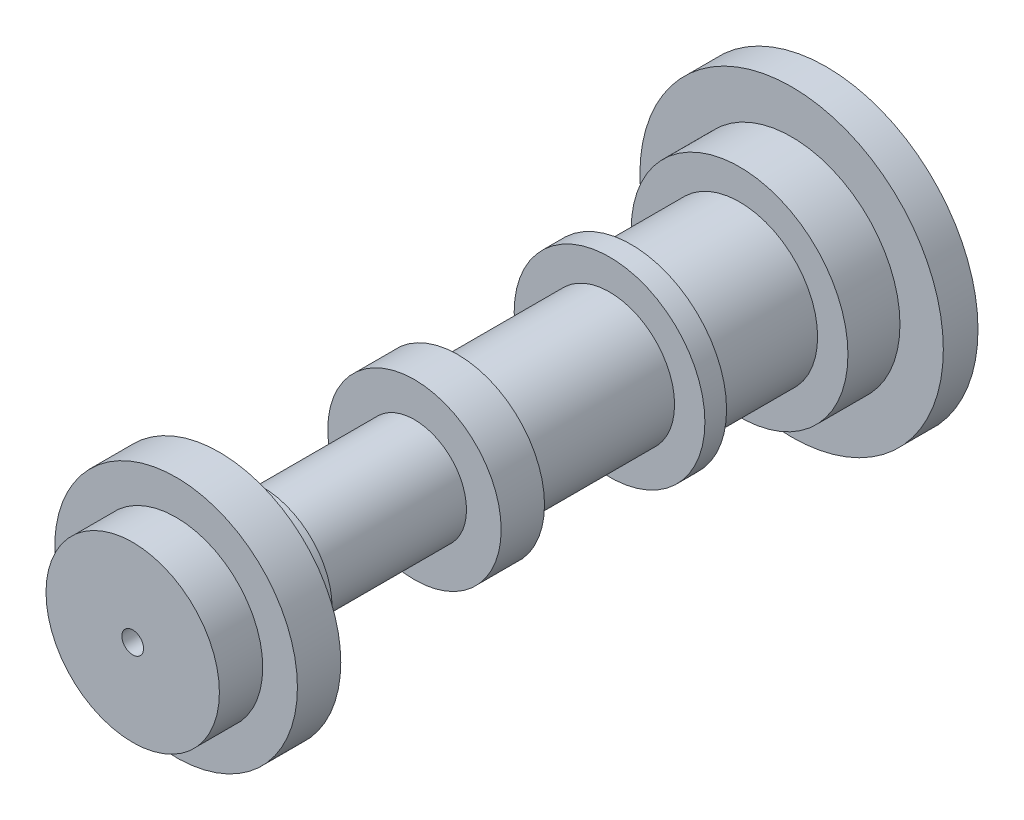
ISO-10303-21;
HEADER;
FILE_DESCRIPTION(('STEP AP214'),'2;1');
FILE_NAME('part.step','',(''),(''),'','','');
FILE_SCHEMA(('AUTOMOTIVE_DESIGN { 1 0 10303 214 1 1 1 1 }'));
ENDSEC;
DATA;
#1=APPLICATION_CONTEXT('core data for automotive mechanical design processes');
#2=APPLICATION_PROTOCOL_DEFINITION('international standard','automotive_design',2000,#1);
#3=PRODUCT_CONTEXT('',#1,'mechanical');
#4=PRODUCT('Part','Part','',(#3));
#5=PRODUCT_RELATED_PRODUCT_CATEGORY('part','',(#4));
#6=PRODUCT_DEFINITION_FORMATION('','',#4);
#7=PRODUCT_DEFINITION_CONTEXT('part definition',#1,'design');
#8=PRODUCT_DEFINITION('design','',#6,#7);
#9=PRODUCT_DEFINITION_SHAPE('','',#8);
#10=(LENGTH_UNIT() NAMED_UNIT(*) SI_UNIT(.MILLI.,.METRE.));
#11=(NAMED_UNIT(*) PLANE_ANGLE_UNIT() SI_UNIT($,.RADIAN.));
#12=(NAMED_UNIT(*) SI_UNIT($,.STERADIAN.) SOLID_ANGLE_UNIT());
#13=UNCERTAINTY_MEASURE_WITH_UNIT(LENGTH_MEASURE(1.E-05),#10,'distance_accuracy_value','');
#14=(GEOMETRIC_REPRESENTATION_CONTEXT(3) GLOBAL_UNCERTAINTY_ASSIGNED_CONTEXT((#13)) GLOBAL_UNIT_ASSIGNED_CONTEXT((#10,
#11,#12)) REPRESENTATION_CONTEXT('',''));
#15=CARTESIAN_POINT('',(0.,0.,0.));
#16=DIRECTION('',(0.,0.,1.));
#17=DIRECTION('',(1.,0.,0.));
#18=AXIS2_PLACEMENT_3D('',#15,#16,#17);
#19=CARTESIAN_POINT('',(0.,0.,85.));
#20=DIRECTION('',(0.,0.,1.));
#21=DIRECTION('',(1.,0.,0.));
#22=AXIS2_PLACEMENT_3D('',#19,#20,#21);
#23=CYLINDRICAL_SURFACE('',#22,20.);
#24=CARTESIAN_POINT('',(0.,0.,85.));
#25=DIRECTION('',(0.,0.,1.));
#26=DIRECTION('',(1.,0.,0.));
#27=AXIS2_PLACEMENT_3D('',#24,#25,#26);
#28=CIRCLE('',#27,20.);
#29=CARTESIAN_POINT('',(20.,0.,85.));
#30=VERTEX_POINT('',#29);
#31=EDGE_CURVE('E331',#30,#30,#28,.T.);
#32=ORIENTED_EDGE('',*,*,#31,.T.);
#33=DIRECTION('',(0.,0.,1.));
#34=VECTOR('',#33,1.);
#35=CARTESIAN_POINT('',(20.,0.,85.));
#36=LINE('',#35,#34);
#37=CARTESIAN_POINT('',(20.,0.,95.));
#38=VERTEX_POINT('',#37);
#39=EDGE_CURVE('E10',#30,#38,#36,.T.);
#40=ORIENTED_EDGE('',*,*,#39,.T.);
#41=CARTESIAN_POINT('',(0.,0.,95.));
#42=DIRECTION('',(0.,0.,1.));
#43=DIRECTION('',(1.,0.,0.));
#44=AXIS2_PLACEMENT_3D('',#41,#42,#43);
#45=CIRCLE('',#44,20.);
#46=EDGE_CURVE('E25',#38,#38,#45,.T.);
#47=ORIENTED_EDGE('',*,*,#46,.F.);
#48=ORIENTED_EDGE('',*,*,#39,.F.);
#49=EDGE_LOOP('',(#32,#40,#47,#48));
#50=FACE_BOUND('',#49,.T.);
#51=ADVANCED_FACE('F16',(#50),#23,.T.);
#52=CARTESIAN_POINT('',(0.,0.,95.));
#53=DIRECTION('',(0.,0.,1.));
#54=DIRECTION('',(1.,0.,0.));
#55=AXIS2_PLACEMENT_3D('',#52,#53,#54);
#56=PLANE('',#55);
#57=CARTESIAN_POINT('',(0.,0.,95.));
#58=DIRECTION('',(0.,0.,1.));
#59=DIRECTION('',(1.,0.,0.));
#60=AXIS2_PLACEMENT_3D('',#57,#58,#59);
#61=CIRCLE('',#60,12.);
#62=CARTESIAN_POINT('',(12.,0.,95.));
#63=VERTEX_POINT('',#62);
#64=EDGE_CURVE('E324',#63,#63,#61,.T.);
#65=ORIENTED_EDGE('',*,*,#64,.F.);
#66=EDGE_LOOP('',(#65));
#67=FACE_BOUND('',#66,.T.);
#68=ORIENTED_EDGE('',*,*,#46,.T.);
#69=EDGE_LOOP('',(#68));
#70=FACE_BOUND('',#69,.T.);
#71=ADVANCED_FACE('F336',(#67,#70),#56,.T.);
#72=CARTESIAN_POINT('',(0.,0.,85.));
#73=DIRECTION('',(0.,0.,1.));
#74=DIRECTION('',(1.,0.,0.));
#75=AXIS2_PLACEMENT_3D('',#72,#73,#74);
#76=PLANE('',#75);
#77=ORIENTED_EDGE('',*,*,#31,.F.);
#78=EDGE_LOOP('',(#77));
#79=FACE_BOUND('',#78,.T.);
#80=CARTESIAN_POINT('',(0.,0.,85.));
#81=DIRECTION('',(0.,0.,1.));
#82=DIRECTION('',(1.,0.,0.));
#83=AXIS2_PLACEMENT_3D('',#80,#81,#82);
#84=CIRCLE('',#83,15.);
#85=CARTESIAN_POINT('',(15.,0.,85.));
#86=VERTEX_POINT('',#85);
#87=EDGE_CURVE('E321',#86,#86,#84,.T.);
#88=ORIENTED_EDGE('',*,*,#87,.T.);
#89=EDGE_LOOP('',(#88));
#90=FACE_BOUND('',#89,.T.);
#91=ADVANCED_FACE('F18',(#79,#90),#76,.F.);
#92=CARTESIAN_POINT('',(0.,0.,95.));
#93=DIRECTION('',(0.,0.,1.));
#94=DIRECTION('',(1.,0.,0.));
#95=AXIS2_PLACEMENT_3D('',#92,#93,#94);
#96=CYLINDRICAL_SURFACE('',#95,12.);
#97=ORIENTED_EDGE('',*,*,#64,.T.);
#98=DIRECTION('',(0.,0.,1.));
#99=VECTOR('',#98,1.);
#100=CARTESIAN_POINT('',(12.,0.,95.));
#101=LINE('',#100,#99);
#102=CARTESIAN_POINT('',(12.,0.,130.));
#103=VERTEX_POINT('',#102);
#104=EDGE_CURVE('E328',#63,#103,#101,.T.);
#105=ORIENTED_EDGE('',*,*,#104,.T.);
#106=CARTESIAN_POINT('',(0.,0.,130.));
#107=DIRECTION('',(0.,0.,1.));
#108=DIRECTION('',(1.,0.,0.));
#109=AXIS2_PLACEMENT_3D('',#106,#107,#108);
#110=CIRCLE('',#109,12.);
#111=EDGE_CURVE('E313',#103,#103,#110,.T.);
#112=ORIENTED_EDGE('',*,*,#111,.F.);
#113=ORIENTED_EDGE('',*,*,#104,.F.);
#114=EDGE_LOOP('',(#97,#105,#112,#113));
#115=FACE_BOUND('',#114,.T.);
#116=ADVANCED_FACE('F346',(#115),#96,.T.);
#117=CARTESIAN_POINT('',(0.,0.,50.));
#118=DIRECTION('',(0.,0.,1.));
#119=DIRECTION('',(1.,0.,0.));
#120=AXIS2_PLACEMENT_3D('',#117,#118,#119);
#121=CYLINDRICAL_SURFACE('',#120,15.);
#122=CARTESIAN_POINT('',(0.,0.,50.));
#123=DIRECTION('',(0.,0.,1.));
#124=DIRECTION('',(1.,0.,0.));
#125=AXIS2_PLACEMENT_3D('',#122,#123,#124);
#126=CIRCLE('',#125,15.);
#127=CARTESIAN_POINT('',(15.,0.,50.));
#128=VERTEX_POINT('',#127);
#129=EDGE_CURVE('E309',#128,#128,#126,.T.);
#130=ORIENTED_EDGE('',*,*,#129,.T.);
#131=DIRECTION('',(0.,0.,1.));
#132=VECTOR('',#131,1.);
#133=CARTESIAN_POINT('',(15.,0.,50.));
#134=LINE('',#133,#132);
#135=EDGE_CURVE('E317',#128,#86,#134,.T.);
#136=ORIENTED_EDGE('',*,*,#135,.T.);
#137=ORIENTED_EDGE('',*,*,#87,.F.);
#138=ORIENTED_EDGE('',*,*,#135,.F.);
#139=EDGE_LOOP('',(#130,#136,#137,#138));
#140=FACE_BOUND('',#139,.T.);
#141=ADVANCED_FACE('F349',(#140),#121,.T.);
#142=CARTESIAN_POINT('',(0.,0.,130.));
#143=DIRECTION('',(0.,0.,1.));
#144=DIRECTION('',(1.,0.,0.));
#145=AXIS2_PLACEMENT_3D('',#142,#143,#144);
#146=PLANE('',#145);
#147=CARTESIAN_POINT('',(0.,0.,130.));
#148=DIRECTION('',(0.,0.,1.));
#149=DIRECTION('',(1.,0.,0.));
#150=AXIS2_PLACEMENT_3D('',#147,#148,#149);
#151=CIRCLE('',#150,16.);
#152=CARTESIAN_POINT('',(16.,0.,130.));
#153=VERTEX_POINT('',#152);
#154=EDGE_CURVE('E300',#153,#153,#151,.T.);
#155=ORIENTED_EDGE('',*,*,#154,.F.);
#156=EDGE_LOOP('',(#155));
#157=FACE_BOUND('',#156,.T.);
#158=ORIENTED_EDGE('',*,*,#111,.T.);
#159=EDGE_LOOP('',(#158));
#160=FACE_BOUND('',#159,.T.);
#161=ADVANCED_FACE('F353',(#157,#160),#146,.F.);
#162=CARTESIAN_POINT('',(0.,0.,50.));
#163=DIRECTION('',(0.,0.,1.));
#164=DIRECTION('',(1.,0.,0.));
#165=AXIS2_PLACEMENT_3D('',#162,#163,#164);
#166=PLANE('',#165);
#167=ORIENTED_EDGE('',*,*,#129,.F.);
#168=EDGE_LOOP('',(#167));
#169=FACE_BOUND('',#168,.T.);
#170=CARTESIAN_POINT('',(0.,0.,50.));
#171=DIRECTION('',(0.,0.,1.));
#172=DIRECTION('',(1.,0.,0.));
#173=AXIS2_PLACEMENT_3D('',#170,#171,#172);
#174=CIRCLE('',#173,22.);
#175=CARTESIAN_POINT('',(22.,0.,50.));
#176=VERTEX_POINT('',#175);
#177=EDGE_CURVE('E299',#176,#176,#174,.T.);
#178=ORIENTED_EDGE('',*,*,#177,.T.);
#179=EDGE_LOOP('',(#178));
#180=FACE_BOUND('',#179,.T.);
#181=ADVANCED_FACE('F357',(#169,#180),#166,.T.);
#182=CARTESIAN_POINT('',(0.,0.,130.));
#183=DIRECTION('',(0.,0.,1.));
#184=DIRECTION('',(1.,0.,0.));
#185=AXIS2_PLACEMENT_3D('',#182,#183,#184);
#186=CYLINDRICAL_SURFACE('',#185,16.);
#187=ORIENTED_EDGE('',*,*,#154,.T.);
#188=DIRECTION('',(0.,0.,1.));
#189=VECTOR('',#188,1.);
#190=CARTESIAN_POINT('',(16.,0.,130.));
#191=LINE('',#190,#189);
#192=CARTESIAN_POINT('',(16.,0.,140.));
#193=VERTEX_POINT('',#192);
#194=EDGE_CURVE('E304',#153,#193,#191,.T.);
#195=ORIENTED_EDGE('',*,*,#194,.T.);
#196=CARTESIAN_POINT('',(0.,0.,140.));
#197=DIRECTION('',(0.,0.,1.));
#198=DIRECTION('',(1.,0.,0.));
#199=AXIS2_PLACEMENT_3D('',#196,#197,#198);
#200=CIRCLE('',#199,16.);
#201=EDGE_CURVE('E291',#193,#193,#200,.T.);
#202=ORIENTED_EDGE('',*,*,#201,.F.);
#203=ORIENTED_EDGE('',*,*,#194,.F.);
#204=EDGE_LOOP('',(#187,#195,#202,#203));
#205=FACE_BOUND('',#204,.T.);
#206=ADVANCED_FACE('F361',(#205),#186,.T.);
#207=CARTESIAN_POINT('',(0.,0.,45.));
#208=DIRECTION('',(0.,0.,1.));
#209=DIRECTION('',(1.,0.,0.));
#210=AXIS2_PLACEMENT_3D('',#207,#208,#209);
#211=CYLINDRICAL_SURFACE('',#210,22.);
#212=CARTESIAN_POINT('',(0.,0.,45.));
#213=DIRECTION('',(0.,0.,1.));
#214=DIRECTION('',(1.,0.,0.));
#215=AXIS2_PLACEMENT_3D('',#212,#213,#214);
#216=CIRCLE('',#215,22.);
#217=CARTESIAN_POINT('',(22.,0.,45.));
#218=VERTEX_POINT('',#217);
#219=EDGE_CURVE('E287',#218,#218,#216,.T.);
#220=ORIENTED_EDGE('',*,*,#219,.T.);
#221=DIRECTION('',(0.,0.,1.));
#222=VECTOR('',#221,1.);
#223=CARTESIAN_POINT('',(22.,0.,45.));
#224=LINE('',#223,#222);
#225=EDGE_CURVE('E295',#218,#176,#224,.T.);
#226=ORIENTED_EDGE('',*,*,#225,.T.);
#227=ORIENTED_EDGE('',*,*,#177,.F.);
#228=ORIENTED_EDGE('',*,*,#225,.F.);
#229=EDGE_LOOP('',(#220,#226,#227,#228));
#230=FACE_BOUND('',#229,.T.);
#231=ADVANCED_FACE('F364',(#230),#211,.T.);
#232=CARTESIAN_POINT('',(0.,0.,140.));
#233=DIRECTION('',(0.,0.,1.));
#234=DIRECTION('',(1.,0.,0.));
#235=AXIS2_PLACEMENT_3D('',#232,#233,#234);
#236=PLANE('',#235);
#237=CARTESIAN_POINT('',(0.,0.,140.));
#238=DIRECTION('',(0.,0.,1.));
#239=DIRECTION('',(1.,0.,0.));
#240=AXIS2_PLACEMENT_3D('',#237,#238,#239);
#241=CIRCLE('',#240,28.);
#242=CARTESIAN_POINT('',(28.,0.,140.));
#243=VERTEX_POINT('',#242);
#244=EDGE_CURVE('E280',#243,#243,#241,.T.);
#245=ORIENTED_EDGE('',*,*,#244,.F.);
#246=EDGE_LOOP('',(#245));
#247=FACE_BOUND('',#246,.T.);
#248=ORIENTED_EDGE('',*,*,#201,.T.);
#249=EDGE_LOOP('',(#248));
#250=FACE_BOUND('',#249,.T.);
#251=ADVANCED_FACE('F369',(#247,#250),#236,.F.);
#252=CARTESIAN_POINT('',(0.,0.,45.));
#253=DIRECTION('',(0.,0.,1.));
#254=DIRECTION('',(1.,0.,0.));
#255=AXIS2_PLACEMENT_3D('',#252,#253,#254);
#256=PLANE('',#255);
#257=ORIENTED_EDGE('',*,*,#219,.F.);
#258=EDGE_LOOP('',(#257));
#259=FACE_BOUND('',#258,.T.);
#260=CARTESIAN_POINT('',(0.,0.,45.));
#261=DIRECTION('',(0.,0.,1.));
#262=DIRECTION('',(1.,0.,0.));
#263=AXIS2_PLACEMENT_3D('',#260,#261,#262);
#264=CIRCLE('',#263,18.);
#265=CARTESIAN_POINT('',(18.,0.,45.));
#266=VERTEX_POINT('',#265);
#267=EDGE_CURVE('E277',#266,#266,#264,.T.);
#268=ORIENTED_EDGE('',*,*,#267,.T.);
#269=EDGE_LOOP('',(#268));
#270=FACE_BOUND('',#269,.T.);
#271=ADVANCED_FACE('F373',(#259,#270),#256,.F.);
#272=CARTESIAN_POINT('',(0.,0.,140.));
#273=DIRECTION('',(0.,0.,1.));
#274=DIRECTION('',(1.,0.,0.));
#275=AXIS2_PLACEMENT_3D('',#272,#273,#274);
#276=CYLINDRICAL_SURFACE('',#275,28.);
#277=ORIENTED_EDGE('',*,*,#244,.T.);
#278=DIRECTION('',(0.,0.,1.));
#279=VECTOR('',#278,1.);
#280=CARTESIAN_POINT('',(28.,0.,140.));
#281=LINE('',#280,#279);
#282=CARTESIAN_POINT('',(28.,0.,150.));
#283=VERTEX_POINT('',#282);
#284=EDGE_CURVE('E284',#243,#283,#281,.T.);
#285=ORIENTED_EDGE('',*,*,#284,.T.);
#286=CARTESIAN_POINT('',(0.,0.,150.));
#287=DIRECTION('',(0.,0.,1.));
#288=DIRECTION('',(1.,0.,0.));
#289=AXIS2_PLACEMENT_3D('',#286,#287,#288);
#290=CIRCLE('',#289,28.);
#291=EDGE_CURVE('E246',#283,#283,#290,.T.);
#292=ORIENTED_EDGE('',*,*,#291,.F.);
#293=ORIENTED_EDGE('',*,*,#284,.F.);
#294=EDGE_LOOP('',(#277,#285,#292,#293));
#295=FACE_BOUND('',#294,.T.);
#296=ADVANCED_FACE('F379',(#295),#276,.T.);
#297=CARTESIAN_POINT('',(0.,0.,20.));
#298=DIRECTION('',(0.,0.,1.));
#299=DIRECTION('',(1.,0.,0.));
#300=AXIS2_PLACEMENT_3D('',#297,#298,#299);
#301=CYLINDRICAL_SURFACE('',#300,18.);
#302=CARTESIAN_POINT('',(0.,0.,20.));
#303=DIRECTION('',(0.,0.,1.));
#304=DIRECTION('',(1.,0.,0.));
#305=AXIS2_PLACEMENT_3D('',#302,#303,#304);
#306=CIRCLE('',#305,18.);
#307=CARTESIAN_POINT('',(18.,0.,20.));
#308=VERTEX_POINT('',#307);
#309=EDGE_CURVE('E254',#308,#308,#306,.T.);
#310=ORIENTED_EDGE('',*,*,#309,.T.);
#311=DIRECTION('',(0.,0.,1.));
#312=VECTOR('',#311,1.);
#313=CARTESIAN_POINT('',(18.,0.,20.));
#314=LINE('',#313,#312);
#315=EDGE_CURVE('E253',#308,#266,#314,.T.);
#316=ORIENTED_EDGE('',*,*,#315,.T.);
#317=ORIENTED_EDGE('',*,*,#267,.F.);
#318=ORIENTED_EDGE('',*,*,#315,.F.);
#319=EDGE_LOOP('',(#310,#316,#317,#318));
#320=FACE_BOUND('',#319,.T.);
#321=ADVANCED_FACE('F375',(#320),#301,.T.);
#322=CARTESIAN_POINT('',(0.,0.,150.));
#323=DIRECTION('',(0.,0.,1.));
#324=DIRECTION('',(1.,0.,0.));
#325=AXIS2_PLACEMENT_3D('',#322,#323,#324);
#326=PLANE('',#325);
#327=CARTESIAN_POINT('',(0.,0.,150.));
#328=DIRECTION('',(0.,0.,1.));
#329=DIRECTION('',(1.,0.,0.));
#330=AXIS2_PLACEMENT_3D('',#327,#328,#329);
#331=CIRCLE('',#330,20.);
#332=CARTESIAN_POINT('',(20.,0.,150.));
#333=VERTEX_POINT('',#332);
#334=EDGE_CURVE('E264',#333,#333,#331,.T.);
#335=ORIENTED_EDGE('',*,*,#334,.F.);
#336=EDGE_LOOP('',(#335));
#337=FACE_BOUND('',#336,.T.);
#338=ORIENTED_EDGE('',*,*,#291,.T.);
#339=EDGE_LOOP('',(#338));
#340=FACE_BOUND('',#339,.T.);
#341=ADVANCED_FACE('F378',(#337,#340),#326,.T.);
#342=CARTESIAN_POINT('',(0.,0.,20.));
#343=DIRECTION('',(0.,0.,1.));
#344=DIRECTION('',(1.,0.,0.));
#345=AXIS2_PLACEMENT_3D('',#342,#343,#344);
#346=PLANE('',#345);
#347=ORIENTED_EDGE('',*,*,#309,.F.);
#348=EDGE_LOOP('',(#347));
#349=FACE_BOUND('',#348,.T.);
#350=CARTESIAN_POINT('',(0.,0.,20.));
#351=DIRECTION('',(0.,0.,1.));
#352=DIRECTION('',(1.,0.,0.));
#353=AXIS2_PLACEMENT_3D('',#350,#351,#352);
#354=CIRCLE('',#353,25.);
#355=CARTESIAN_POINT('',(25.,0.,20.));
#356=VERTEX_POINT('',#355);
#357=EDGE_CURVE('E240',#356,#356,#354,.T.);
#358=ORIENTED_EDGE('',*,*,#357,.T.);
#359=EDGE_LOOP('',(#358));
#360=FACE_BOUND('',#359,.T.);
#361=ADVANCED_FACE('F389',(#349,#360),#346,.T.);
#362=CARTESIAN_POINT('',(24.491194523982,-0.04327504183174,3.935409580208));
#363=DIRECTION('',(-0.0127321503142022,-0.999917222174171,-0.00185503311746331));
#364=DIRECTION('',(-0.999918942610119,0.0127321722208647,0.));
#365=AXIS2_PLACEMENT_3D('',#362,#363,#364);
#366=PLANE('',#365);
#367=CARTESIAN_POINT('',(24.624048443109,-0.04413878898903,3.489142393827));
#368=CARTESIAN_POINT('',(26.5205402971,-0.07054449870163,4.705888623014));
#369=(BOUNDED_CURVE() B_SPLINE_CURVE(1,(#367,#368),.UNSPECIFIED.,.F.,
.F.) B_SPLINE_CURVE_WITH_KNOTS((2,2),(0.,2.253408529317),
.UNSPECIFIED.) CURVE() GEOMETRIC_REPRESENTATION_ITEM() RATIONAL_B_SPLINE_CURVE((1.,1.)) REPRESENTATION_ITEM(''));
#370=CARTESIAN_POINT('',(24.624048443109,-0.04413878898903,3.489142393827));
#371=VERTEX_POINT('',#370);
#372=CARTESIAN_POINT('',(26.5205402971,-0.07054449870163,4.705888623014));
#373=VERTEX_POINT('',#372);
#374=EDGE_CURVE('E187',#371,#373,#369,.T.);
#375=ORIENTED_EDGE('',*,*,#374,.T.);
#376=CARTESIAN_POINT('',(26.5205402971,-0.07054449870163,4.705888623014));
#377=CARTESIAN_POINT('',(22.370900679457,-0.01541428785405,3.470432551947));
#378=(BOUNDED_CURVE() B_SPLINE_CURVE(1,(#376,#377),.UNSPECIFIED.,.F.,
.F.) B_SPLINE_CURVE_WITH_KNOTS((2,2),(0.,4.33),
.UNSPECIFIED.) CURVE() GEOMETRIC_REPRESENTATION_ITEM() RATIONAL_B_SPLINE_CURVE((1.,1.)) REPRESENTATION_ITEM(''));
#379=CARTESIAN_POINT('',(22.370900679457,-0.01541428785405,3.470432551947));
#380=VERTEX_POINT('',#379);
#381=EDGE_CURVE('E206',#373,#380,#378,.T.);
#382=ORIENTED_EDGE('',*,*,#381,.T.);
#383=CARTESIAN_POINT('',(22.370900679457,-0.01541428785405,3.470432551947));
#384=CARTESIAN_POINT('',(24.624048443109,-0.04413878898903,3.489142393827));
#385=(BOUNDED_CURVE() B_SPLINE_CURVE(1,(#383,#384),.UNSPECIFIED.,.F.,
.F.) B_SPLINE_CURVE_WITH_KNOTS((2,2),(0.,2.253408529317),
.UNSPECIFIED.) CURVE() GEOMETRIC_REPRESENTATION_ITEM() RATIONAL_B_SPLINE_CURVE((1.,1.)) REPRESENTATION_ITEM(''));
#386=EDGE_CURVE('E181',#380,#371,#385,.T.);
#387=ORIENTED_EDGE('',*,*,#386,.T.);
#388=EDGE_LOOP('',(#375,#382,#387));
#389=FACE_BOUND('',#388,.T.);
#390=ADVANCED_FACE('F408',(#389),#366,.T.);
#391=CARTESIAN_POINT('',(0.,0.,150.));
#392=DIRECTION('',(0.,0.,1.));
#393=DIRECTION('',(1.,0.,0.));
#394=AXIS2_PLACEMENT_3D('',#391,#392,#393);
#395=CYLINDRICAL_SURFACE('',#394,20.);
#396=ORIENTED_EDGE('',*,*,#334,.T.);
#397=DIRECTION('',(0.,0.,1.));
#398=VECTOR('',#397,1.);
#399=CARTESIAN_POINT('',(20.,0.,150.));
#400=LINE('',#399,#398);
#401=CARTESIAN_POINT('',(20.,0.,160.));
#402=VERTEX_POINT('',#401);
#403=EDGE_CURVE('E268',#333,#402,#400,.T.);
#404=ORIENTED_EDGE('',*,*,#403,.T.);
#405=CARTESIAN_POINT('',(0.,0.,160.));
#406=DIRECTION('',(0.,0.,1.));
#407=DIRECTION('',(1.,0.,0.));
#408=AXIS2_PLACEMENT_3D('',#405,#406,#407);
#409=CIRCLE('',#408,20.);
#410=EDGE_CURVE('E231',#402,#402,#409,.T.);
#411=ORIENTED_EDGE('',*,*,#410,.F.);
#412=ORIENTED_EDGE('',*,*,#403,.F.);
#413=EDGE_LOOP('',(#396,#404,#411,#412));
#414=FACE_BOUND('',#413,.T.);
#415=ADVANCED_FACE('F385',(#414),#395,.T.);
#416=CARTESIAN_POINT('',(0.,0.,8.));
#417=DIRECTION('',(0.,0.,1.));
#418=DIRECTION('',(1.,0.,0.));
#419=AXIS2_PLACEMENT_3D('',#416,#417,#418);
#420=CYLINDRICAL_SURFACE('',#419,25.);
#421=CARTESIAN_POINT('',(0.,0.,8.));
#422=DIRECTION('',(0.,0.,1.));
#423=DIRECTION('',(1.,0.,0.));
#424=AXIS2_PLACEMENT_3D('',#421,#422,#423);
#425=CIRCLE('',#424,25.);
#426=CARTESIAN_POINT('',(25.,0.,8.));
#427=VERTEX_POINT('',#426);
#428=EDGE_CURVE('E224',#427,#427,#425,.T.);
#429=ORIENTED_EDGE('',*,*,#428,.T.);
#430=DIRECTION('',(0.,0.,1.));
#431=VECTOR('',#430,1.);
#432=CARTESIAN_POINT('',(25.,0.,8.));
#433=LINE('',#432,#431);
#434=EDGE_CURVE('E236',#427,#356,#433,.T.);
#435=ORIENTED_EDGE('',*,*,#434,.T.);
#436=ORIENTED_EDGE('',*,*,#357,.F.);
#437=ORIENTED_EDGE('',*,*,#434,.F.);
#438=EDGE_LOOP('',(#429,#435,#436,#437));
#439=FACE_BOUND('',#438,.T.);
#440=ADVANCED_FACE('F381',(#439),#420,.T.);
#441=CARTESIAN_POINT('',(0.,0.,0.));
#442=CARTESIAN_POINT('',(1.230431771827,0.005871800931862,-0.004086971408472));
#443=CARTESIAN_POINT('',(2.455568121686,0.869020610491,0.01196284594141));
#444=CARTESIAN_POINT('',(3.182290926081,2.590495735677,0.04685987788109));
#445=CARTESIAN_POINT('',(2.880230233196,4.866330749076,0.103308947431));
#446=CARTESIAN_POINT('',(1.280615577607,7.094213354344,0.177336526859));
#447=CARTESIAN_POINT('',(-1.579840317336,8.508298943587,0.273498649581));
#448=CARTESIAN_POINT('',(-5.100942111298,8.502506963589,0.387876068694));
#449=CARTESIAN_POINT('',(-8.53626888323,6.876701433573,0.523044049507));
#450=CARTESIAN_POINT('',(-11.11801598194,3.859349909009,0.677744737696));
#451=CARTESIAN_POINT('',(-13.57855170141,-3.89485342789,1.027042058902));
#452=CARTESIAN_POINT('',(-13.45352695528,-8.631909083152,1.22148553514));
#453=CARTESIAN_POINT('',(-11.47511626432,-13.69605045387,1.435924256721));
#454=CARTESIAN_POINT('',(-7.353991649431,-18.25508503753,1.670210324569));
#455=CARTESIAN_POINT('',(-1.298572612119,-21.29024615266,1.923511435184));
#456=CARTESIAN_POINT('',(6.013737067874,-21.89168792084,2.198507353601));
#457=CARTESIAN_POINT('',(13.342766160861,-19.60275627723,2.490507989691));
#458=CARTESIAN_POINT('',(19.470883527664,-14.64358380392,2.804630082805));
#459=CARTESIAN_POINT('',(23.394230914252,-7.769709374334,3.136804915497));
#460=CARTESIAN_POINT('',(24.624048443109,-0.04413878898903,3.489142393827));
#461=CARTESIAN_POINT('',(2.165,0.,0.625));
#462=CARTESIAN_POINT('',(3.386384465201,0.684611289215,0.652252898744));
#463=CARTESIAN_POINT('',(4.36556194636,2.220316520652,0.699412976511));
#464=CARTESIAN_POINT('',(4.612972343448,4.514346956081,0.765454584273));
#465=CARTESIAN_POINT('',(3.644370321724,7.173152661463,0.8526384293));
#466=CARTESIAN_POINT('',(1.276640716685,9.525200278201,0.95738186646));
#467=CARTESIAN_POINT('',(-2.341194963932,10.786661082604,1.084151753567));
#468=CARTESIAN_POINT('',(-6.50200372983,10.381482738668,1.228693352834));
#469=CARTESIAN_POINT('',(-10.38225579262,8.185090993645,1.394085592715));
#470=CARTESIAN_POINT('',(-13.17943311905,4.516381980866,1.578656155392));
#471=CARTESIAN_POINT('',(-15.62158512645,-4.524610583501,1.987351117623));
#472=CARTESIAN_POINT('',(-15.26278879505,-9.897219912958,2.211230745144));
#473=CARTESIAN_POINT('',(-12.83085238918,-15.50035186261,2.455028424058));
#474=CARTESIAN_POINT('',(-8.081543562267,-20.41744829648,2.718170360477));
#475=CARTESIAN_POINT('',(-1.305345397009,-23.56643370043,3.000363635086));
#476=CARTESIAN_POINT('',(6.71454648391,-24.02257560373,3.303882711467));
#477=CARTESIAN_POINT('',(14.638474117564,-21.35914124257,3.624046834582));
#478=CARTESIAN_POINT('',(21.178441529456,-15.86861627845,3.966266335407));
#479=CARTESIAN_POINT('',(25.300055679177,-8.390676768963,4.32610120318));
#480=CARTESIAN_POINT('',(26.5205402971,-0.07054449870163,4.705888623014));
#481=(BOUNDED_SURFACE() B_SPLINE_SURFACE(1,10,((#441,#442,#443,#444,#445,#446,#447,#448,#449,
#450,#451,#452,#453,#454,#455,#456,#457,#458,#459,#460),(#461,#462,#463,#464,#465,#466,#467,
#468,#469,#470,#471,#472,#473,#474,#475,#476,#477,#478,#479,#480)),.UNSPECIFIED.,.F.,.F.,
.F.) B_SPLINE_SURFACE_WITH_KNOTS((2,2),(11,9,11),(0.,2.253408529317),(0.,0.5,1.),
.UNSPECIFIED.) GEOMETRIC_REPRESENTATION_ITEM() RATIONAL_B_SPLINE_SURFACE(((1.,1.,1.,1.,1.,1.,1.,
1.,1.,1.,1.,1.,1.,1.,1.,1.,1.,1.,1.,1.),(1.,1.,1.,1.,1.,1.,1.,1.,1.,1.,1.,1.,1.,1.,1.,1.,1.,1.,
1.,1.))) REPRESENTATION_ITEM('') SURFACE());
#482=CARTESIAN_POINT('',(0.,0.,0.));
#483=CARTESIAN_POINT('',(1.230431771827,0.005871800931862,-0.004086971408472));
#484=CARTESIAN_POINT('',(2.455568121686,0.869020610491,0.01196284594141));
#485=CARTESIAN_POINT('',(3.182290926081,2.590495735677,0.04685987788109));
#486=CARTESIAN_POINT('',(2.880230233196,4.866330749076,0.103308947431));
#487=CARTESIAN_POINT('',(1.280615577607,7.094213354344,0.177336526859));
#488=CARTESIAN_POINT('',(-1.579840317336,8.508298943587,0.273498649581));
#489=CARTESIAN_POINT('',(-5.100942111298,8.502506963589,0.387876068694));
#490=CARTESIAN_POINT('',(-8.53626888323,6.876701433573,0.523044049507));
#491=CARTESIAN_POINT('',(-11.11801598194,3.859349909009,0.677744737696));
#492=CARTESIAN_POINT('',(-13.57855170141,-3.89485342789,1.027042058902));
#493=CARTESIAN_POINT('',(-13.45352695528,-8.631909083152,1.22148553514));
#494=CARTESIAN_POINT('',(-11.47511626432,-13.69605045387,1.435924256721));
#495=CARTESIAN_POINT('',(-7.353991649431,-18.25508503753,1.670210324569));
#496=CARTESIAN_POINT('',(-1.298572612119,-21.29024615266,1.923511435184));
#497=CARTESIAN_POINT('',(6.013737067874,-21.89168792084,2.198507353601));
#498=CARTESIAN_POINT('',(13.342766160861,-19.60275627723,2.490507989691));
#499=CARTESIAN_POINT('',(19.470883527664,-14.64358380392,2.804630082805));
#500=CARTESIAN_POINT('',(23.394230914252,-7.769709374334,3.136804915497));
#501=CARTESIAN_POINT('',(24.624048443109,-0.04413878898903,3.489142393827));
#502=(BOUNDED_CURVE() B_SPLINE_CURVE(10,(#482,#483,#484,#485,#486,#487,#488,#489,#490,#491,#492,
#493,#494,#495,#496,#497,#498,#499,#500,#501),.UNSPECIFIED.,.F.,
.F.) B_SPLINE_CURVE_WITH_KNOTS((11,9,11),(0.,0.5,1.),
.UNSPECIFIED.) CURVE() GEOMETRIC_REPRESENTATION_ITEM() RATIONAL_B_SPLINE_CURVE((1.,1.,1.,1.,1.,
1.,1.,1.,1.,1.,1.,1.,1.,1.,1.,1.,1.,1.,1.,1.)) REPRESENTATION_ITEM(''));
#503=CARTESIAN_POINT('',(2.002556967409,1.496584642539,0.02854663263037));
#504=VERTEX_POINT('',#503);
#505=EDGE_CURVE('E188',#504,#371,#502,.T.);
#506=CARTESIAN_POINT('',(2.490621341423,0.216345403574,0.633147503592));
#507=CARTESIAN_POINT('',(2.478458382284,0.356368371963,0.575191747016));
#508=CARTESIAN_POINT('',(2.45648241013,0.495223503842,0.5165594871));
#509=CARTESIAN_POINT('',(2.42486401805,0.631973533698,0.457248635784));
#510=CARTESIAN_POINT('',(2.383909739951,0.765737227712,0.397261511036));
#511=CARTESIAN_POINT('',(2.284456709617,1.024892658518,0.276309133067));
#512=CARTESIAN_POINT('',(2.226064218663,1.150330946062,0.215351320812));
#513=CARTESIAN_POINT('',(2.159263153863,1.271224315269,0.153735172604));
#514=CARTESIAN_POINT('',(2.084563492342,1.386852968693,0.09146506846171));
#515=CARTESIAN_POINT('',(2.002556967409,1.496584642539,0.02854663263037));
#516=(BOUNDED_CURVE() B_SPLINE_CURVE(5,(#506,#507,#508,#509,#510,#511,#512,#513,#514,#515),
.UNSPECIFIED.,.F.,.F.) B_SPLINE_CURVE_WITH_KNOTS((6,4,6),(0.,0.501503719603,1.),
.UNSPECIFIED.) CURVE() GEOMETRIC_REPRESENTATION_ITEM() RATIONAL_B_SPLINE_CURVE((1.,1.,1.,1.,1.,
1.,1.,1.,1.,1.)) REPRESENTATION_ITEM(''));
#517=CARTESIAN_POINT('',(2.490621341423,0.216345403574,0.633147503592));
#518=VERTEX_POINT('',#517);
#519=EDGE_CURVE('E171',#518,#504,#516,.T.);
#520=CARTESIAN_POINT('',(2.165,0.,0.625));
#521=CARTESIAN_POINT('',(3.386384465201,0.684611289215,0.652252898744));
#522=CARTESIAN_POINT('',(4.36556194636,2.220316520652,0.699412976511));
#523=CARTESIAN_POINT('',(4.612972343448,4.514346956081,0.765454584273));
#524=CARTESIAN_POINT('',(3.644370321724,7.173152661463,0.8526384293));
#525=CARTESIAN_POINT('',(1.276640716685,9.525200278201,0.95738186646));
#526=CARTESIAN_POINT('',(-2.341194963932,10.786661082604,1.084151753567));
#527=CARTESIAN_POINT('',(-6.50200372983,10.381482738668,1.228693352834));
#528=CARTESIAN_POINT('',(-10.38225579262,8.185090993645,1.394085592715));
#529=CARTESIAN_POINT('',(-13.17943311905,4.516381980866,1.578656155392));
#530=CARTESIAN_POINT('',(-15.62158512645,-4.524610583501,1.987351117623));
#531=CARTESIAN_POINT('',(-15.26278879505,-9.897219912958,2.211230745144));
#532=CARTESIAN_POINT('',(-12.83085238918,-15.50035186261,2.455028424058));
#533=CARTESIAN_POINT('',(-8.081543562267,-20.41744829648,2.718170360477));
#534=CARTESIAN_POINT('',(-1.305345397009,-23.56643370043,3.000363635086));
#535=CARTESIAN_POINT('',(6.71454648391,-24.02257560373,3.303882711467));
#536=CARTESIAN_POINT('',(14.638474117564,-21.35914124257,3.624046834582));
#537=CARTESIAN_POINT('',(21.178441529456,-15.86861627845,3.966266335407));
#538=CARTESIAN_POINT('',(25.300055679177,-8.390676768963,4.32610120318));
#539=CARTESIAN_POINT('',(26.5205402971,-0.07054449870163,4.705888623014));
#540=(BOUNDED_CURVE() B_SPLINE_CURVE(10,(#520,#521,#522,#523,#524,#525,#526,#527,#528,#529,#530,
#531,#532,#533,#534,#535,#536,#537,#538,#539),.UNSPECIFIED.,.F.,
.F.) B_SPLINE_CURVE_WITH_KNOTS((11,9,11),(0.,0.5,1.),
.UNSPECIFIED.) CURVE() GEOMETRIC_REPRESENTATION_ITEM() RATIONAL_B_SPLINE_CURVE((1.,1.,1.,1.,1.,
1.,1.,1.,1.,1.,1.,1.,1.,1.,1.,1.,1.,1.,1.,1.)) REPRESENTATION_ITEM(''));
#541=EDGE_CURVE('E235',#518,#373,#540,.T.);
#542=ORIENTED_EDGE('',*,*,#505,.F.);
#543=ORIENTED_EDGE('',*,*,#519,.F.);
#544=ORIENTED_EDGE('',*,*,#541,.T.);
#545=ORIENTED_EDGE('',*,*,#374,.F.);
#546=EDGE_LOOP('',(#542,#543,#544,#545));
#547=FACE_BOUND('',#546,.T.);
#548=ADVANCED_FACE('F384',(#547),#481,.T.);
#549=CARTESIAN_POINT('',(-2.165,0.,0.625));
#550=CARTESIAN_POINT('',(-0.943615534799,-0.67286828874,0.589573158439));
#551=CARTESIAN_POINT('',(0.509434041411,-0.494891550374,0.574221679791));
#552=CARTESIAN_POINT('',(1.704726696474,0.628820894393,0.577395135454));
#553=CARTESIAN_POINT('',(2.073548806312,2.488260096655,0.602229186465));
#554=CARTESIAN_POINT('',(1.265417469983,4.559351561935,0.644395265566));
#555=CARTESIAN_POINT('',(-0.795838161708,6.105235548121,0.708475058937));
#556=CARTESIAN_POINT('',(-3.625751623011,6.498853073038,0.790965202946));
#557=CARTESIAN_POINT('',(-6.565924801412,5.467268583537,0.893866784334));
#558=CARTESIAN_POINT('',(-8.894462377962,3.145234433658,1.016381377094));
#559=CARTESIAN_POINT('',(-11.33721567104,-3.209178164793,1.301064955803));
#560=CARTESIAN_POINT('',(-11.44763085094,-7.241627813436,1.463180445571));
#561=CARTESIAN_POINT('',(-9.951417003741,-11.6929744022,1.64506996502));
#562=CARTESIAN_POINT('',(-6.518337652625,-15.8274545645,1.84704035608));
#563=CARTESIAN_POINT('',(-1.27168417152,-18.70456780366,2.06769886077));
#564=CARTESIAN_POINT('',(5.226822035062,-19.44234852901,2.310115223386));
#565=CARTESIAN_POINT('',(11.854521001138,-17.56101438733,2.569660561657));
#566=CARTESIAN_POINT('',(17.481789994626,-13.204928326,2.851062088004));
#567=CARTESIAN_POINT('',(21.149817639553,-7.034610086615,3.150707273752));
#568=CARTESIAN_POINT('',(22.370900679457,-0.01541428785405,3.470432551947));
#569=CARTESIAN_POINT('',(0.,0.,0.));
#570=CARTESIAN_POINT('',(1.230431771827,0.00587180093185,-0.004086971408471));
#571=CARTESIAN_POINT('',(2.455568121686,0.869020610491,0.01196284594141));
#572=CARTESIAN_POINT('',(3.182290926081,2.590495735677,0.04685987788109));
#573=CARTESIAN_POINT('',(2.880230233196,4.866330749076,0.103308947431));
#574=CARTESIAN_POINT('',(1.280615577607,7.094213354344,0.177336526859));
#575=CARTESIAN_POINT('',(-1.579840317336,8.508298943587,0.273498649581));
#576=CARTESIAN_POINT('',(-5.100942111298,8.502506963589,0.387876068694));
#577=CARTESIAN_POINT('',(-8.53626888323,6.876701433573,0.523044049507));
#578=CARTESIAN_POINT('',(-11.11801598194,3.859349909009,0.677744737696));
#579=CARTESIAN_POINT('',(-13.57855170141,-3.89485342789,1.027042058902));
#580=CARTESIAN_POINT('',(-13.45352695528,-8.631909083151,1.22148553514));
#581=CARTESIAN_POINT('',(-11.47511626431,-13.69605045387,1.435924256721));
#582=CARTESIAN_POINT('',(-7.353991649432,-18.25508503753,1.67021032457));
#583=CARTESIAN_POINT('',(-1.298572612118,-21.29024615267,1.923511435184));
#584=CARTESIAN_POINT('',(6.013737067873,-21.89168792084,2.198507353601));
#585=CARTESIAN_POINT('',(13.342766160861,-19.60275627724,2.490507989691));
#586=CARTESIAN_POINT('',(19.470883527664,-14.64358380392,2.804630082806));
#587=CARTESIAN_POINT('',(23.394230914252,-7.769709374334,3.136804915497));
#588=CARTESIAN_POINT('',(24.624048443109,-0.04413878898903,3.489142393827));
#589=(BOUNDED_SURFACE() B_SPLINE_SURFACE(1,10,((#549,#550,#551,#552,#553,#554,#555,#556,#557,
#558,#559,#560,#561,#562,#563,#564,#565,#566,#567,#568),(#569,#570,#571,#572,#573,#574,#575,
#576,#577,#578,#579,#580,#581,#582,#583,#584,#585,#586,#587,#588)),.UNSPECIFIED.,.F.,.F.,
.F.) B_SPLINE_SURFACE_WITH_KNOTS((2,2),(11,9,11),(0.,2.253408529317),(0.,0.5,1.),
.UNSPECIFIED.) GEOMETRIC_REPRESENTATION_ITEM() RATIONAL_B_SPLINE_SURFACE(((1.,1.,1.,1.,1.,1.,1.,
1.,1.,1.,1.,1.,1.,1.,1.,1.,1.,1.,1.,1.),(1.,1.,1.,1.,1.,1.,1.,1.,1.,1.,1.,1.,1.,1.,1.,1.,1.,1.,
1.,1.))) REPRESENTATION_ITEM('') SURFACE());
#590=CARTESIAN_POINT('',(-2.165,0.,0.625));
#591=CARTESIAN_POINT('',(-0.943615534799,-0.67286828874,0.589573158439));
#592=CARTESIAN_POINT('',(0.509434041411,-0.494891550374,0.574221679791));
#593=CARTESIAN_POINT('',(1.704726696474,0.628820894393,0.577395135454));
#594=CARTESIAN_POINT('',(2.073548806312,2.488260096655,0.602229186465));
#595=CARTESIAN_POINT('',(1.265417469983,4.559351561935,0.644395265566));
#596=CARTESIAN_POINT('',(-0.795838161708,6.105235548121,0.708475058937));
#597=CARTESIAN_POINT('',(-3.625751623011,6.498853073038,0.790965202946));
#598=CARTESIAN_POINT('',(-6.565924801412,5.467268583537,0.893866784334));
#599=CARTESIAN_POINT('',(-8.894462377962,3.145234433658,1.016381377094));
#600=CARTESIAN_POINT('',(-11.33721567104,-3.209178164793,1.301064955803));
#601=CARTESIAN_POINT('',(-11.44763085094,-7.241627813436,1.463180445571));
#602=CARTESIAN_POINT('',(-9.951417003741,-11.6929744022,1.64506996502));
#603=CARTESIAN_POINT('',(-6.518337652625,-15.8274545645,1.84704035608));
#604=CARTESIAN_POINT('',(-1.27168417152,-18.70456780366,2.06769886077));
#605=CARTESIAN_POINT('',(5.226822035062,-19.44234852901,2.310115223386));
#606=CARTESIAN_POINT('',(11.854521001138,-17.56101438733,2.569660561657));
#607=CARTESIAN_POINT('',(17.481789994626,-13.204928326,2.851062088004));
#608=CARTESIAN_POINT('',(21.149817639553,-7.034610086615,3.150707273752));
#609=CARTESIAN_POINT('',(22.370900679457,-0.01541428785405,3.470432551947));
#610=(BOUNDED_CURVE() B_SPLINE_CURVE(10,(#590,#591,#592,#593,#594,#595,#596,#597,#598,#599,#600,
#601,#602,#603,#604,#605,#606,#607,#608,#609),.UNSPECIFIED.,.F.,
.F.) B_SPLINE_CURVE_WITH_KNOTS((11,9,11),(0.,0.5,1.),
.UNSPECIFIED.) CURVE() GEOMETRIC_REPRESENTATION_ITEM() RATIONAL_B_SPLINE_CURVE((1.,1.,1.,1.,1.,
1.,1.,1.,1.,1.,1.,1.,1.,1.,1.,1.,1.,1.,1.,1.)) REPRESENTATION_ITEM(''));
#611=CARTESIAN_POINT('',(0.893205759099,2.334991107459,0.61881352138));
#612=VERTEX_POINT('',#611);
#613=EDGE_CURVE('E215',#612,#380,#610,.T.);
#614=CARTESIAN_POINT('',(2.002556967409,1.496584642539,0.02854663263037));
#615=CARTESIAN_POINT('',(1.918827807406,1.608621347963,0.09028010434091));
#616=CARTESIAN_POINT('',(1.82707793298,1.715050901757,0.151361632022));
#617=CARTESIAN_POINT('',(1.727786736769,1.815087048979,0.211786236381));
#618=CARTESIAN_POINT('',(1.621550236622,1.908004055495,0.271551011585));
#619=CARTESIAN_POINT('',(1.396847988535,2.078130947383,0.38961428021));
#620=CARTESIAN_POINT('',(1.278410016206,2.155377563509,0.447916429611));
#621=CARTESIAN_POINT('',(1.154450391603,2.224274406685,0.505552641369));
#622=CARTESIAN_POINT('',(1.025760227702,2.284284955143,0.562519948396));
#623=CARTESIAN_POINT('',(0.893205759099,2.334991107459,0.61881352138));
#624=(BOUNDED_CURVE() B_SPLINE_CURVE(5,(#614,#615,#616,#617,#618,#619,#620,#621,#622,#623),
.UNSPECIFIED.,.F.,.F.) B_SPLINE_CURVE_WITH_KNOTS((6,4,6),(0.,0.500579775853,1.),
.UNSPECIFIED.) CURVE() GEOMETRIC_REPRESENTATION_ITEM() RATIONAL_B_SPLINE_CURVE((1.,1.,1.,1.,1.,
1.,1.,1.,1.,1.)) REPRESENTATION_ITEM(''));
#625=EDGE_CURVE('E197',#504,#612,#624,.T.);
#626=ORIENTED_EDGE('',*,*,#613,.F.);
#627=ORIENTED_EDGE('',*,*,#625,.F.);
#628=ORIENTED_EDGE('',*,*,#505,.T.);
#629=ORIENTED_EDGE('',*,*,#386,.F.);
#630=EDGE_LOOP('',(#626,#627,#628,#629));
#631=FACE_BOUND('',#630,.T.);
#632=ADVANCED_FACE('F394',(#631),#589,.T.);
#633=CARTESIAN_POINT('',(2.165,0.,0.625));
#634=CARTESIAN_POINT('',(3.386384465201,0.684611289215,0.652252898744));
#635=CARTESIAN_POINT('',(4.36556194636,2.220316520652,0.699412976511));
#636=CARTESIAN_POINT('',(4.612972343448,4.514346956081,0.765454584273));
#637=CARTESIAN_POINT('',(3.644370321724,7.173152661463,0.8526384293));
#638=CARTESIAN_POINT('',(1.276640716685,9.525200278201,0.95738186646));
#639=CARTESIAN_POINT('',(-2.341194963932,10.786661082604,1.084151753567));
#640=CARTESIAN_POINT('',(-6.50200372983,10.381482738668,1.228693352834));
#641=CARTESIAN_POINT('',(-10.38225579262,8.185090993645,1.394085592715));
#642=CARTESIAN_POINT('',(-13.17943311905,4.516381980866,1.578656155392));
#643=CARTESIAN_POINT('',(-15.62158512645,-4.524610583501,1.987351117623));
#644=CARTESIAN_POINT('',(-15.26278879505,-9.897219912958,2.211230745144));
#645=CARTESIAN_POINT('',(-12.83085238918,-15.50035186261,2.455028424058));
#646=CARTESIAN_POINT('',(-8.081543562267,-20.41744829648,2.718170360477));
#647=CARTESIAN_POINT('',(-1.305345397009,-23.56643370043,3.000363635086));
#648=CARTESIAN_POINT('',(6.71454648391,-24.02257560373,3.303882711467));
#649=CARTESIAN_POINT('',(14.638474117564,-21.35914124257,3.624046834582));
#650=CARTESIAN_POINT('',(21.178441529456,-15.86861627845,3.966266335407));
#651=CARTESIAN_POINT('',(25.300055679177,-8.390676768963,4.32610120318));
#652=CARTESIAN_POINT('',(26.5205402971,-0.07054449870163,4.705888623014));
#653=CARTESIAN_POINT('',(-2.165,0.,0.625));
#654=CARTESIAN_POINT('',(-0.943615534799,-0.67286828874,0.589573158439));
#655=CARTESIAN_POINT('',(0.509434041411,-0.494891550374,0.574221679791));
#656=CARTESIAN_POINT('',(1.704726696474,0.628820894393,0.577395135454));
#657=CARTESIAN_POINT('',(2.073548806312,2.488260096655,0.602229186465));
#658=CARTESIAN_POINT('',(1.265417469983,4.559351561935,0.644395265566));
#659=CARTESIAN_POINT('',(-0.795838161708,6.105235548121,0.708475058937));
#660=CARTESIAN_POINT('',(-3.625751623011,6.498853073038,0.790965202946));
#661=CARTESIAN_POINT('',(-6.565924801412,5.467268583537,0.893866784334));
#662=CARTESIAN_POINT('',(-8.894462377962,3.145234433658,1.016381377094));
#663=CARTESIAN_POINT('',(-11.33721567104,-3.209178164793,1.301064955803));
#664=CARTESIAN_POINT('',(-11.44763085094,-7.241627813436,1.463180445571));
#665=CARTESIAN_POINT('',(-9.951417003741,-11.6929744022,1.64506996502));
#666=CARTESIAN_POINT('',(-6.518337652625,-15.8274545645,1.84704035608));
#667=CARTESIAN_POINT('',(-1.27168417152,-18.70456780366,2.06769886077));
#668=CARTESIAN_POINT('',(5.226822035062,-19.44234852901,2.310115223386));
#669=CARTESIAN_POINT('',(11.854521001138,-17.56101438733,2.569660561657));
#670=CARTESIAN_POINT('',(17.481789994626,-13.204928326,2.851062088004));
#671=CARTESIAN_POINT('',(21.149817639553,-7.034610086615,3.150707273752));
#672=CARTESIAN_POINT('',(22.370900679457,-0.01541428785405,3.470432551947));
#673=(BOUNDED_SURFACE() B_SPLINE_SURFACE(1,10,((#633,#634,#635,#636,#637,#638,#639,#640,#641,
#642,#643,#644,#645,#646,#647,#648,#649,#650,#651,#652),(#653,#654,#655,#656,#657,#658,#659,
#660,#661,#662,#663,#664,#665,#666,#667,#668,#669,#670,#671,#672)),.UNSPECIFIED.,.F.,.F.,
.F.) B_SPLINE_SURFACE_WITH_KNOTS((2,2),(11,9,11),(0.,4.33),(0.,0.5,1.),
.UNSPECIFIED.) GEOMETRIC_REPRESENTATION_ITEM() RATIONAL_B_SPLINE_SURFACE(((1.,1.,1.,1.,1.,1.,1.,
1.,1.,1.,1.,1.,1.,1.,1.,1.,1.,1.,1.,1.),(1.,1.,1.,1.,1.,1.,1.,1.,1.,1.,1.,1.,1.,1.,1.,1.,1.,1.,
1.,1.))) REPRESENTATION_ITEM('') SURFACE());
#674=CARTESIAN_POINT('',(0.893205759099,2.334991107459,0.61881352138));
#675=CARTESIAN_POINT('',(1.023540306245,2.28513414323,0.625079301667));
#676=CARTESIAN_POINT('',(1.150446810898,2.226164028941,0.630653136146));
#677=CARTESIAN_POINT('',(1.2730674337,2.158392880699,0.63553434507));
#678=CARTESIAN_POINT('',(1.390591131283,2.082253685856,0.639722642569));
#679=CARTESIAN_POINT('',(1.613978654223,1.914314892848,0.646713046739));
#680=CARTESIAN_POINT('',(1.719842399431,1.822512549309,0.649515030972));
#681=CARTESIAN_POINT('',(1.819129902775,1.723424820286,0.651623240854));
#682=CARTESIAN_POINT('',(1.911181868696,1.617697755321,0.653037443727));
#683=CARTESIAN_POINT('',(2.079717386055,1.394398381837,0.654477215823));
#684=CARTESIAN_POINT('',(2.156198249267,1.276822034057,0.654502465843));
#685=CARTESIAN_POINT('',(2.224323454139,1.154062342076,0.65383267961));
#686=CARTESIAN_POINT('',(2.283640980277,1.026924022821,0.652467323849));
#687=CARTESIAN_POINT('',(2.384012182725,0.765564178603,0.648344980008));
#688=CARTESIAN_POINT('',(2.425060102794,0.631338752796,0.645587474963));
#689=CARTESIAN_POINT('',(2.456628666709,0.494450981169,0.642134299274));
#690=CARTESIAN_POINT('',(2.478507026162,0.35580837172,0.63798596507));
#691=CARTESIAN_POINT('',(2.490621341423,0.216345403574,0.633147503592));
#692=(BOUNDED_CURVE() B_SPLINE_CURVE(5,(#674,#675,#676,#677,#678,#679,#680,#681,#682,#683,#684,
#685,#686,#687,#688,#689,#690,#691),.UNSPECIFIED.,.F.,.F.) B_SPLINE_CURVE_WITH_KNOTS((6,4,4,4,
6),(0.,0.249927800358,0.499884392346,0.749899053647,1.),
.UNSPECIFIED.) CURVE() GEOMETRIC_REPRESENTATION_ITEM() RATIONAL_B_SPLINE_CURVE((1.,1.,1.,1.,1.,
1.,1.,1.,1.,1.,1.,1.,1.,1.,1.,1.,1.,1.)) REPRESENTATION_ITEM(''));
#693=EDGE_CURVE('E165',#612,#518,#692,.T.);
#694=ORIENTED_EDGE('',*,*,#541,.F.);
#695=ORIENTED_EDGE('',*,*,#693,.F.);
#696=ORIENTED_EDGE('',*,*,#613,.T.);
#697=ORIENTED_EDGE('',*,*,#381,.F.);
#698=EDGE_LOOP('',(#694,#695,#696,#697));
#699=FACE_BOUND('',#698,.T.);
#700=ADVANCED_FACE('F399',(#699),#673,.T.);
#701=CARTESIAN_POINT('',(0.,0.,160.));
#702=DIRECTION('',(0.,0.,1.));
#703=DIRECTION('',(1.,0.,0.));
#704=AXIS2_PLACEMENT_3D('',#701,#702,#703);
#705=PLANE('',#704);
#706=CARTESIAN_POINT('',(0.,0.,160.));
#707=DIRECTION('',(0.,0.,-1.));
#708=DIRECTION('',(1.,0.,0.));
#709=AXIS2_PLACEMENT_3D('',#706,#707,#708);
#710=CIRCLE('',#709,2.5);
#711=CARTESIAN_POINT('',(2.5,0.,160.));
#712=VERTEX_POINT('',#711);
#713=EDGE_CURVE('E172',#712,#712,#710,.T.);
#714=ORIENTED_EDGE('',*,*,#713,.T.);
#715=EDGE_LOOP('',(#714));
#716=FACE_BOUND('',#715,.T.);
#717=ORIENTED_EDGE('',*,*,#410,.T.);
#718=EDGE_LOOP('',(#717));
#719=FACE_BOUND('',#718,.T.);
#720=ADVANCED_FACE('F414',(#716,#719),#705,.T.);
#721=CARTESIAN_POINT('',(0.,0.,8.));
#722=DIRECTION('',(0.,0.,1.));
#723=DIRECTION('',(1.,0.,0.));
#724=AXIS2_PLACEMENT_3D('',#721,#722,#723);
#725=PLANE('',#724);
#726=ORIENTED_EDGE('',*,*,#428,.F.);
#727=EDGE_LOOP('',(#726));
#728=FACE_BOUND('',#727,.T.);
#729=CARTESIAN_POINT('',(0.,0.,8.));
#730=DIRECTION('',(0.,0.,1.));
#731=DIRECTION('',(1.,0.,0.));
#732=AXIS2_PLACEMENT_3D('',#729,#730,#731);
#733=CIRCLE('',#732,35.);
#734=CARTESIAN_POINT('',(35.,0.,8.));
#735=VERTEX_POINT('',#734);
#736=EDGE_CURVE('E152',#735,#735,#733,.T.);
#737=ORIENTED_EDGE('',*,*,#736,.T.);
#738=EDGE_LOOP('',(#737));
#739=FACE_BOUND('',#738,.T.);
#740=ADVANCED_FACE('F426',(#728,#739),#725,.T.);
#741=CARTESIAN_POINT('',(0.,0.,0.));
#742=DIRECTION('',(0.,0.,-1.));
#743=DIRECTION('',(1.,0.,0.));
#744=AXIS2_PLACEMENT_3D('',#741,#742,#743);
#745=CYLINDRICAL_SURFACE('',#744,2.5);
#746=ORIENTED_EDGE('',*,*,#693,.T.);
#747=ORIENTED_EDGE('',*,*,#519,.T.);
#748=ORIENTED_EDGE('',*,*,#625,.T.);
#749=EDGE_LOOP('',(#746,#747,#748));
#750=FACE_BOUND('',#749,.T.);
#751=DIRECTION('',(0.,0.,1.));
#752=VECTOR('',#751,1.);
#753=CARTESIAN_POINT('',(2.5,0.,0.));
#754=LINE('',#753,#752);
#755=CARTESIAN_POINT('',(2.5,0.,0.));
#756=VERTEX_POINT('',#755);
#757=EDGE_CURVE('E159',#756,#712,#754,.T.);
#758=ORIENTED_EDGE('',*,*,#757,.F.);
#759=CARTESIAN_POINT('',(0.,0.,0.));
#760=DIRECTION('',(0.,0.,1.));
#761=DIRECTION('',(1.,0.,0.));
#762=AXIS2_PLACEMENT_3D('',#759,#760,#761);
#763=CIRCLE('',#762,2.5);
#764=EDGE_CURVE('E154',#756,#756,#763,.T.);
#765=ORIENTED_EDGE('',*,*,#764,.F.);
#766=ORIENTED_EDGE('',*,*,#757,.T.);
#767=ORIENTED_EDGE('',*,*,#713,.F.);
#768=EDGE_LOOP('',(#758,#765,#766,#767));
#769=FACE_BOUND('',#768,.T.);
#770=ADVANCED_FACE('F430',(#750,#769),#745,.F.);
#771=CARTESIAN_POINT('',(0.,0.,0.));
#772=DIRECTION('',(0.,0.,1.));
#773=DIRECTION('',(1.,0.,0.));
#774=AXIS2_PLACEMENT_3D('',#771,#772,#773);
#775=CYLINDRICAL_SURFACE('',#774,35.);
#776=CARTESIAN_POINT('',(0.,0.,0.));
#777=DIRECTION('',(0.,0.,1.));
#778=DIRECTION('',(1.,0.,0.));
#779=AXIS2_PLACEMENT_3D('',#776,#777,#778);
#780=CIRCLE('',#779,35.);
#781=CARTESIAN_POINT('',(35.,0.,0.));
#782=VERTEX_POINT('',#781);
#783=EDGE_CURVE('E151',#782,#782,#780,.T.);
#784=ORIENTED_EDGE('',*,*,#783,.T.);
#785=DIRECTION('',(0.,0.,1.));
#786=VECTOR('',#785,1.);
#787=CARTESIAN_POINT('',(35.,0.,0.));
#788=LINE('',#787,#786);
#789=EDGE_CURVE('E148',#782,#735,#788,.T.);
#790=ORIENTED_EDGE('',*,*,#789,.T.);
#791=ORIENTED_EDGE('',*,*,#736,.F.);
#792=ORIENTED_EDGE('',*,*,#789,.F.);
#793=EDGE_LOOP('',(#784,#790,#791,#792));
#794=FACE_BOUND('',#793,.T.);
#795=ADVANCED_FACE('F149',(#794),#775,.T.);
#796=CARTESIAN_POINT('',(0.,0.,0.));
#797=DIRECTION('',(0.,0.,1.));
#798=DIRECTION('',(1.,0.,0.));
#799=AXIS2_PLACEMENT_3D('',#796,#797,#798);
#800=PLANE('',#799);
#801=ORIENTED_EDGE('',*,*,#764,.T.);
#802=EDGE_LOOP('',(#801));
#803=FACE_BOUND('',#802,.T.);
#804=ORIENTED_EDGE('',*,*,#783,.F.);
#805=EDGE_LOOP('',(#804));
#806=FACE_BOUND('',#805,.T.);
#807=ADVANCED_FACE('F450',(#803,#806),#800,.F.);
#808=CLOSED_SHELL('',(#51,#71,#91,#116,#141,#161,#181,#206,#231,#251,#271,#296,#321,#341,#361,
#390,#415,#440,#548,#632,#700,#720,#740,#770,#795,#807));
#809=MANIFOLD_SOLID_BREP('B1',#808);
#810=ADVANCED_BREP_SHAPE_REPRESENTATION('',(#18,#809),#14);
#811=SHAPE_DEFINITION_REPRESENTATION(#9,#810);
ENDSEC;
END-ISO-10303-21;
